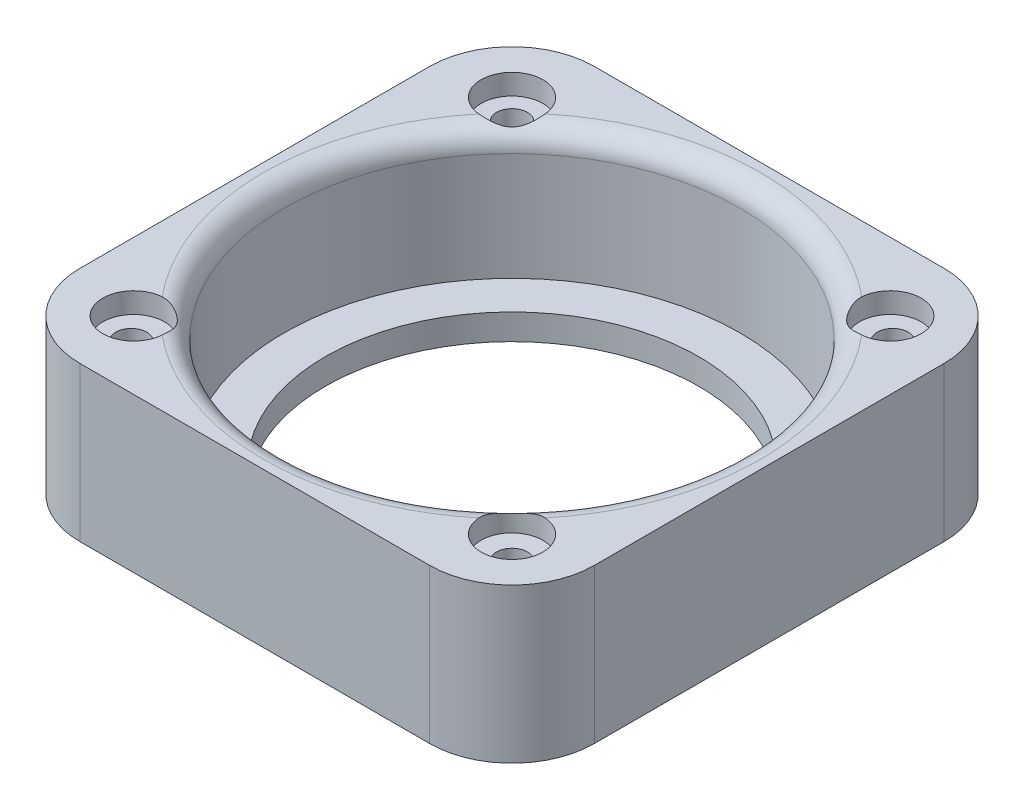
ISO-10303-21;
HEADER;
FILE_DESCRIPTION(('STEP AP214'),'2;1');
FILE_NAME('part.step','',(''),(''),'','','');
FILE_SCHEMA(('AUTOMOTIVE_DESIGN { 1 0 10303 214 1 1 1 1 }'));
ENDSEC;
DATA;
#1=APPLICATION_CONTEXT('core data for automotive mechanical design processes');
#2=APPLICATION_PROTOCOL_DEFINITION('international standard','automotive_design',2000,#1);
#3=PRODUCT_CONTEXT('',#1,'mechanical');
#4=PRODUCT('Part','Part','',(#3));
#5=PRODUCT_RELATED_PRODUCT_CATEGORY('part','',(#4));
#6=PRODUCT_DEFINITION_FORMATION('','',#4);
#7=PRODUCT_DEFINITION_CONTEXT('part definition',#1,'design');
#8=PRODUCT_DEFINITION('design','',#6,#7);
#9=PRODUCT_DEFINITION_SHAPE('','',#8);
#10=(LENGTH_UNIT() NAMED_UNIT(*) SI_UNIT(.MILLI.,.METRE.));
#11=(NAMED_UNIT(*) PLANE_ANGLE_UNIT() SI_UNIT($,.RADIAN.));
#12=(NAMED_UNIT(*) SI_UNIT($,.STERADIAN.) SOLID_ANGLE_UNIT());
#13=UNCERTAINTY_MEASURE_WITH_UNIT(LENGTH_MEASURE(1.E-05),#10,'distance_accuracy_value','');
#14=(GEOMETRIC_REPRESENTATION_CONTEXT(3) GLOBAL_UNCERTAINTY_ASSIGNED_CONTEXT((#13)) GLOBAL_UNIT_ASSIGNED_CONTEXT((#10,
#11,#12)) REPRESENTATION_CONTEXT('',''));
#15=CARTESIAN_POINT('',(0.,0.,0.));
#16=DIRECTION('',(0.,0.,1.));
#17=DIRECTION('',(1.,0.,0.));
#18=AXIS2_PLACEMENT_3D('',#15,#16,#17);
#19=CARTESIAN_POINT('',(18.6152236891498,15.,-18.3847763108513));
#20=DIRECTION('',(0.,-1.,0.));
#21=DIRECTION('',(0.,0.,-1.));
#22=AXIS2_PLACEMENT_3D('',#19,#20,#21);
#23=CYLINDRICAL_SURFACE('',#22,1.5);
#24=CARTESIAN_POINT('',(18.6152236891498,0.,-18.3847763108513));
#25=DIRECTION('',(0.,1.,0.));
#26=DIRECTION('',(0.,0.,1.));
#27=AXIS2_PLACEMENT_3D('',#24,#25,#26);
#28=CIRCLE('',#27,1.5);
#29=CARTESIAN_POINT('',(18.6152236891498,0.,-16.8847763108513));
#30=VERTEX_POINT('',#29);
#31=EDGE_CURVE('E261',#30,#30,#28,.T.);
#32=ORIENTED_EDGE('',*,*,#31,.F.);
#33=EDGE_LOOP('',(#32));
#34=FACE_BOUND('',#33,.T.);
#35=CARTESIAN_POINT('',(18.6152236891498,13.,-18.3847763108513));
#36=DIRECTION('',(0.,1.,0.));
#37=DIRECTION('',(0.,0.,1.));
#38=AXIS2_PLACEMENT_3D('',#35,#36,#37);
#39=CIRCLE('',#38,1.5);
#40=CARTESIAN_POINT('',(18.6152236891498,13.,-16.8847763108513));
#41=VERTEX_POINT('',#40);
#42=EDGE_CURVE('E326',#41,#41,#39,.T.);
#43=ORIENTED_EDGE('',*,*,#42,.T.);
#44=EDGE_LOOP('',(#43));
#45=FACE_BOUND('',#44,.T.);
#46=ADVANCED_FACE('F127',(#34,#45),#23,.F.);
#47=CARTESIAN_POINT('',(18.6152236891508,15.,18.6152236891487));
#48=DIRECTION('',(0.,-1.,0.));
#49=DIRECTION('',(0.,0.,-1.));
#50=AXIS2_PLACEMENT_3D('',#47,#48,#49);
#51=CYLINDRICAL_SURFACE('',#50,1.5);
#52=CARTESIAN_POINT('',(18.6152236891508,0.,18.6152236891487));
#53=DIRECTION('',(0.,1.,0.));
#54=DIRECTION('',(0.,0.,1.));
#55=AXIS2_PLACEMENT_3D('',#52,#53,#54);
#56=CIRCLE('',#55,1.5);
#57=CARTESIAN_POINT('',(18.6152236891508,0.,20.1152236891487));
#58=VERTEX_POINT('',#57);
#59=EDGE_CURVE('E246',#58,#58,#56,.T.);
#60=ORIENTED_EDGE('',*,*,#59,.F.);
#61=EDGE_LOOP('',(#60));
#62=FACE_BOUND('',#61,.T.);
#63=CARTESIAN_POINT('',(18.6152236891508,13.,18.6152236891487));
#64=DIRECTION('',(0.,1.,0.));
#65=DIRECTION('',(0.,0.,1.));
#66=AXIS2_PLACEMENT_3D('',#63,#64,#65);
#67=CIRCLE('',#66,1.5);
#68=CARTESIAN_POINT('',(18.6152236891508,13.,20.1152236891487));
#69=VERTEX_POINT('',#68);
#70=EDGE_CURVE('E323',#69,#69,#67,.T.);
#71=ORIENTED_EDGE('',*,*,#70,.T.);
#72=EDGE_LOOP('',(#71));
#73=FACE_BOUND('',#72,.T.);
#74=ADVANCED_FACE('F418',(#62,#73),#51,.F.);
#75=CARTESIAN_POINT('',(-18.3847763108492,15.,18.6152236891498));
#76=DIRECTION('',(0.,-1.,0.));
#77=DIRECTION('',(0.,0.,-1.));
#78=AXIS2_PLACEMENT_3D('',#75,#76,#77);
#79=CYLINDRICAL_SURFACE('',#78,1.5);
#80=CARTESIAN_POINT('',(-18.3847763108492,0.,18.6152236891498));
#81=DIRECTION('',(0.,1.,0.));
#82=DIRECTION('',(0.,0.,1.));
#83=AXIS2_PLACEMENT_3D('',#80,#81,#82);
#84=CIRCLE('',#83,1.5);
#85=CARTESIAN_POINT('',(-18.3847763108492,0.,20.1152236891498));
#86=VERTEX_POINT('',#85);
#87=EDGE_CURVE('E248',#86,#86,#84,.T.);
#88=ORIENTED_EDGE('',*,*,#87,.F.);
#89=EDGE_LOOP('',(#88));
#90=FACE_BOUND('',#89,.T.);
#91=CARTESIAN_POINT('',(-18.3847763108492,13.,18.6152236891498));
#92=DIRECTION('',(0.,1.,0.));
#93=DIRECTION('',(0.,0.,1.));
#94=AXIS2_PLACEMENT_3D('',#91,#92,#93);
#95=CIRCLE('',#94,1.5);
#96=CARTESIAN_POINT('',(-18.3847763108492,13.,20.1152236891498));
#97=VERTEX_POINT('',#96);
#98=EDGE_CURVE('E318',#97,#97,#95,.T.);
#99=ORIENTED_EDGE('',*,*,#98,.T.);
#100=EDGE_LOOP('',(#99));
#101=FACE_BOUND('',#100,.T.);
#102=ADVANCED_FACE('F424',(#90,#101),#79,.F.);
#103=CARTESIAN_POINT('',(-18.3847763108502,15.,-18.3847763108502));
#104=DIRECTION('',(0.,-1.,0.));
#105=DIRECTION('',(0.,0.,-1.));
#106=AXIS2_PLACEMENT_3D('',#103,#104,#105);
#107=CYLINDRICAL_SURFACE('',#106,1.5);
#108=CARTESIAN_POINT('',(-18.3847763108502,0.,-18.3847763108502));
#109=DIRECTION('',(0.,1.,0.));
#110=DIRECTION('',(0.,0.,1.));
#111=AXIS2_PLACEMENT_3D('',#108,#109,#110);
#112=CIRCLE('',#111,1.5);
#113=CARTESIAN_POINT('',(-18.3847763108502,0.,-16.8847763108502));
#114=VERTEX_POINT('',#113);
#115=EDGE_CURVE('E260',#114,#114,#112,.T.);
#116=ORIENTED_EDGE('',*,*,#115,.F.);
#117=EDGE_LOOP('',(#116));
#118=FACE_BOUND('',#117,.T.);
#119=CARTESIAN_POINT('',(-18.3847763108502,13.,-18.3847763108502));
#120=DIRECTION('',(0.,1.,0.));
#121=DIRECTION('',(0.,0.,1.));
#122=AXIS2_PLACEMENT_3D('',#119,#120,#121);
#123=CIRCLE('',#122,1.5);
#124=CARTESIAN_POINT('',(-18.3847763108502,13.,-16.8847763108502));
#125=VERTEX_POINT('',#124);
#126=EDGE_CURVE('E251',#125,#125,#123,.T.);
#127=ORIENTED_EDGE('',*,*,#126,.T.);
#128=EDGE_LOOP('',(#127));
#129=FACE_BOUND('',#128,.T.);
#130=ADVANCED_FACE('F444',(#118,#129),#107,.F.);
#131=CARTESIAN_POINT('',(0.,15.,0.));
#132=DIRECTION('',(0.,1.,0.));
#133=DIRECTION('',(0.,0.,1.));
#134=AXIS2_PLACEMENT_3D('',#131,#132,#133);
#135=PLANE('',#134);
#136=CARTESIAN_POINT('',(-18.3847763108502,15.,-18.3847763108502));
#137=DIRECTION('',(0.,1.,0.));
#138=DIRECTION('',(0.,0.,1.));
#139=AXIS2_PLACEMENT_3D('',#136,#137,#138);
#140=CIRCLE('',#139,3.);
#141=CARTESIAN_POINT('',(-15.3931257833307,15.,-18.6084437452077));
#142=VERTEX_POINT('',#141);
#143=CARTESIAN_POINT('',(-18.6084437452077,15.,-15.3931257833307));
#144=VERTEX_POINT('',#143);
#145=EDGE_CURVE('E321',#142,#144,#140,.T.);
#146=ORIENTED_EDGE('',*,*,#145,.F.);
#147=CARTESIAN_POINT('',(0.,15.,0.));
#148=DIRECTION('',(0.,1.,0.));
#149=DIRECTION('',(0.,0.,1.));
#150=AXIS2_PLACEMENT_3D('',#147,#148,#149);
#151=CIRCLE('',#150,24.15);
#152=CARTESIAN_POINT('',(15.3931257833305,15.,-18.6084437452079));
#153=VERTEX_POINT('',#152);
#154=EDGE_CURVE('E338',#142,#153,#151,.F.);
#155=ORIENTED_EDGE('',*,*,#154,.T.);
#156=CARTESIAN_POINT('',(18.38477631085,15.,-18.3847763108504));
#157=DIRECTION('',(0.,1.,0.));
#158=DIRECTION('',(-1.,0.,0.));
#159=AXIS2_PLACEMENT_3D('',#156,#157,#158);
#160=CIRCLE('',#159,3.);
#161=CARTESIAN_POINT('',(18.6084437452075,15.,-15.3931257833309));
#162=VERTEX_POINT('',#161);
#163=EDGE_CURVE('E393',#162,#153,#160,.T.);
#164=ORIENTED_EDGE('',*,*,#163,.F.);
#165=CARTESIAN_POINT('',(0.,15.,0.));
#166=DIRECTION('',(0.,1.,0.));
#167=DIRECTION('',(0.,0.,1.));
#168=AXIS2_PLACEMENT_3D('',#165,#166,#167);
#169=CIRCLE('',#168,24.15);
#170=CARTESIAN_POINT('',(18.6084437452077,15.,15.3931257833307));
#171=VERTEX_POINT('',#170);
#172=EDGE_CURVE('E336',#162,#171,#169,.F.);
#173=ORIENTED_EDGE('',*,*,#172,.T.);
#174=CARTESIAN_POINT('',(18.3847763108502,15.,18.3847763108502));
#175=DIRECTION('',(0.,1.,0.));
#176=DIRECTION('',(0.,0.,-1.));
#177=AXIS2_PLACEMENT_3D('',#174,#175,#176);
#178=CIRCLE('',#177,3.);
#179=CARTESIAN_POINT('',(15.3931257833307,15.,18.6084437452077));
#180=VERTEX_POINT('',#179);
#181=EDGE_CURVE('E381',#180,#171,#178,.T.);
#182=ORIENTED_EDGE('',*,*,#181,.F.);
#183=CARTESIAN_POINT('',(0.,15.,0.));
#184=DIRECTION('',(0.,1.,0.));
#185=DIRECTION('',(0.,0.,1.));
#186=AXIS2_PLACEMENT_3D('',#183,#184,#185);
#187=CIRCLE('',#186,24.15);
#188=CARTESIAN_POINT('',(-15.3931257833306,15.,18.6084437452078));
#189=VERTEX_POINT('',#188);
#190=EDGE_CURVE('E334',#180,#189,#187,.F.);
#191=ORIENTED_EDGE('',*,*,#190,.T.);
#192=CARTESIAN_POINT('',(-18.3847763108502,15.,18.3847763108503));
#193=DIRECTION('',(0.,1.,0.));
#194=DIRECTION('',(1.,0.,0.));
#195=AXIS2_PLACEMENT_3D('',#192,#193,#194);
#196=CIRCLE('',#195,3.);
#197=CARTESIAN_POINT('',(-18.6084437452077,15.,15.3931257833308));
#198=VERTEX_POINT('',#197);
#199=EDGE_CURVE('E330',#198,#189,#196,.T.);
#200=ORIENTED_EDGE('',*,*,#199,.F.);
#201=CARTESIAN_POINT('',(0.,15.,0.));
#202=DIRECTION('',(0.,1.,0.));
#203=DIRECTION('',(0.,0.,1.));
#204=AXIS2_PLACEMENT_3D('',#201,#202,#203);
#205=CIRCLE('',#204,24.15);
#206=EDGE_CURVE('E147',#198,#144,#205,.F.);
#207=ORIENTED_EDGE('',*,*,#206,.T.);
#208=EDGE_LOOP('',(#146,#155,#164,#173,#182,#191,#200,#207));
#209=FACE_BOUND('',#208,.T.);
#210=DIRECTION('',(0.,0.,1.));
#211=VECTOR('',#210,1.);
#212=CARTESIAN_POINT('',(-25.,15.,0.));
#213=LINE('',#212,#211);
#214=CARTESIAN_POINT('',(-25.,15.,-17.));
#215=VERTEX_POINT('',#214);
#216=CARTESIAN_POINT('',(-25.,15.,17.));
#217=VERTEX_POINT('',#216);
#218=EDGE_CURVE('E269',#215,#217,#213,.T.);
#219=ORIENTED_EDGE('',*,*,#218,.T.);
#220=CARTESIAN_POINT('',(-17.,15.,17.));
#221=DIRECTION('',(0.,1.,0.));
#222=DIRECTION('',(0.,0.,1.));
#223=AXIS2_PLACEMENT_3D('',#220,#221,#222);
#224=CIRCLE('',#223,8.);
#225=CARTESIAN_POINT('',(-17.,15.,25.));
#226=VERTEX_POINT('',#225);
#227=EDGE_CURVE('E302',#217,#226,#224,.T.);
#228=ORIENTED_EDGE('',*,*,#227,.T.);
#229=DIRECTION('',(1.,0.,0.));
#230=VECTOR('',#229,1.);
#231=CARTESIAN_POINT('',(0.,15.,25.));
#232=LINE('',#231,#230);
#233=CARTESIAN_POINT('',(17.,15.,25.));
#234=VERTEX_POINT('',#233);
#235=EDGE_CURVE('E240',#226,#234,#232,.T.);
#236=ORIENTED_EDGE('',*,*,#235,.T.);
#237=CARTESIAN_POINT('',(17.,15.,17.));
#238=DIRECTION('',(0.,1.,0.));
#239=DIRECTION('',(0.,0.,1.));
#240=AXIS2_PLACEMENT_3D('',#237,#238,#239);
#241=CIRCLE('',#240,8.);
#242=CARTESIAN_POINT('',(25.,15.,17.));
#243=VERTEX_POINT('',#242);
#244=EDGE_CURVE('E300',#234,#243,#241,.T.);
#245=ORIENTED_EDGE('',*,*,#244,.T.);
#246=DIRECTION('',(0.,0.,1.));
#247=VECTOR('',#246,1.);
#248=CARTESIAN_POINT('',(25.,15.,0.));
#249=LINE('',#248,#247);
#250=CARTESIAN_POINT('',(25.,15.,-17.));
#251=VERTEX_POINT('',#250);
#252=EDGE_CURVE('E256',#251,#243,#249,.T.);
#253=ORIENTED_EDGE('',*,*,#252,.F.);
#254=CARTESIAN_POINT('',(17.,15.,-17.));
#255=DIRECTION('',(0.,1.,0.));
#256=DIRECTION('',(0.,0.,1.));
#257=AXIS2_PLACEMENT_3D('',#254,#255,#256);
#258=CIRCLE('',#257,8.);
#259=CARTESIAN_POINT('',(17.,15.,-25.));
#260=VERTEX_POINT('',#259);
#261=EDGE_CURVE('E298',#251,#260,#258,.T.);
#262=ORIENTED_EDGE('',*,*,#261,.T.);
#263=DIRECTION('',(1.,0.,0.));
#264=VECTOR('',#263,1.);
#265=CARTESIAN_POINT('',(0.,15.,-25.));
#266=LINE('',#265,#264);
#267=CARTESIAN_POINT('',(-17.,15.,-25.));
#268=VERTEX_POINT('',#267);
#269=EDGE_CURVE('E266',#268,#260,#266,.T.);
#270=ORIENTED_EDGE('',*,*,#269,.F.);
#271=CARTESIAN_POINT('',(-17.,15.,-17.));
#272=DIRECTION('',(0.,1.,0.));
#273=DIRECTION('',(0.,0.,1.));
#274=AXIS2_PLACEMENT_3D('',#271,#272,#273);
#275=CIRCLE('',#274,8.);
#276=EDGE_CURVE('E296',#268,#215,#275,.T.);
#277=ORIENTED_EDGE('',*,*,#276,.T.);
#278=EDGE_LOOP('',(#219,#228,#236,#245,#253,#262,#270,#277));
#279=FACE_BOUND('',#278,.T.);
#280=ADVANCED_FACE('F385',(#209,#279),#135,.T.);
#281=CARTESIAN_POINT('',(0.,0.,0.));
#282=DIRECTION('',(0.,1.,0.));
#283=DIRECTION('',(0.,0.,1.));
#284=AXIS2_PLACEMENT_3D('',#281,#282,#283);
#285=PLANE('',#284);
#286=ORIENTED_EDGE('',*,*,#59,.T.);
#287=EDGE_LOOP('',(#286));
#288=FACE_BOUND('',#287,.T.);
#289=ORIENTED_EDGE('',*,*,#87,.T.);
#290=EDGE_LOOP('',(#289));
#291=FACE_BOUND('',#290,.T.);
#292=ORIENTED_EDGE('',*,*,#31,.T.);
#293=EDGE_LOOP('',(#292));
#294=FACE_BOUND('',#293,.T.);
#295=ORIENTED_EDGE('',*,*,#115,.T.);
#296=EDGE_LOOP('',(#295));
#297=FACE_BOUND('',#296,.T.);
#298=CARTESIAN_POINT('',(0.,0.,0.));
#299=DIRECTION('',(0.,1.,0.));
#300=DIRECTION('',(0.,0.,1.));
#301=AXIS2_PLACEMENT_3D('',#298,#299,#300);
#302=CIRCLE('',#301,18.15);
#303=CARTESIAN_POINT('',(0.,0.,18.15));
#304=VERTEX_POINT('',#303);
#305=EDGE_CURVE('E282',#304,#304,#302,.T.);
#306=ORIENTED_EDGE('',*,*,#305,.T.);
#307=EDGE_LOOP('',(#306));
#308=FACE_BOUND('',#307,.T.);
#309=DIRECTION('',(1.,0.,0.));
#310=VECTOR('',#309,1.);
#311=CARTESIAN_POINT('',(0.,0.,25.));
#312=LINE('',#311,#310);
#313=CARTESIAN_POINT('',(-17.,0.,25.));
#314=VERTEX_POINT('',#313);
#315=CARTESIAN_POINT('',(17.,0.,25.));
#316=VERTEX_POINT('',#315);
#317=EDGE_CURVE('E237',#314,#316,#312,.T.);
#318=ORIENTED_EDGE('',*,*,#317,.F.);
#319=CARTESIAN_POINT('',(-17.,0.,17.));
#320=DIRECTION('',(0.,1.,0.));
#321=DIRECTION('',(0.,0.,1.));
#322=AXIS2_PLACEMENT_3D('',#319,#320,#321);
#323=CIRCLE('',#322,8.);
#324=CARTESIAN_POINT('',(-25.,0.,17.));
#325=VERTEX_POINT('',#324);
#326=EDGE_CURVE('E220',#314,#325,#323,.F.);
#327=ORIENTED_EDGE('',*,*,#326,.T.);
#328=DIRECTION('',(0.,0.,1.));
#329=VECTOR('',#328,1.);
#330=CARTESIAN_POINT('',(-25.,0.,0.));
#331=LINE('',#330,#329);
#332=CARTESIAN_POINT('',(-25.,0.,-17.));
#333=VERTEX_POINT('',#332);
#334=EDGE_CURVE('E270',#333,#325,#331,.T.);
#335=ORIENTED_EDGE('',*,*,#334,.F.);
#336=CARTESIAN_POINT('',(-17.,0.,-17.));
#337=DIRECTION('',(0.,1.,0.));
#338=DIRECTION('',(0.,0.,1.));
#339=AXIS2_PLACEMENT_3D('',#336,#337,#338);
#340=CIRCLE('',#339,8.);
#341=CARTESIAN_POINT('',(-17.,0.,-25.));
#342=VERTEX_POINT('',#341);
#343=EDGE_CURVE('E241',#333,#342,#340,.F.);
#344=ORIENTED_EDGE('',*,*,#343,.T.);
#345=DIRECTION('',(1.,0.,0.));
#346=VECTOR('',#345,1.);
#347=CARTESIAN_POINT('',(0.,0.,-25.));
#348=LINE('',#347,#346);
#349=CARTESIAN_POINT('',(17.,0.,-25.));
#350=VERTEX_POINT('',#349);
#351=EDGE_CURVE('E276',#342,#350,#348,.T.);
#352=ORIENTED_EDGE('',*,*,#351,.T.);
#353=CARTESIAN_POINT('',(17.,0.,-17.));
#354=DIRECTION('',(0.,1.,0.));
#355=DIRECTION('',(0.,0.,1.));
#356=AXIS2_PLACEMENT_3D('',#353,#354,#355);
#357=CIRCLE('',#356,8.);
#358=CARTESIAN_POINT('',(25.,0.,-17.));
#359=VERTEX_POINT('',#358);
#360=EDGE_CURVE('E290',#350,#359,#357,.F.);
#361=ORIENTED_EDGE('',*,*,#360,.T.);
#362=DIRECTION('',(0.,0.,1.));
#363=VECTOR('',#362,1.);
#364=CARTESIAN_POINT('',(25.,0.,0.));
#365=LINE('',#364,#363);
#366=CARTESIAN_POINT('',(25.,0.,17.));
#367=VERTEX_POINT('',#366);
#368=EDGE_CURVE('E258',#359,#367,#365,.T.);
#369=ORIENTED_EDGE('',*,*,#368,.T.);
#370=CARTESIAN_POINT('',(17.,0.,17.));
#371=DIRECTION('',(0.,1.,0.));
#372=DIRECTION('',(0.,0.,1.));
#373=AXIS2_PLACEMENT_3D('',#370,#371,#372);
#374=CIRCLE('',#373,8.);
#375=EDGE_CURVE('E231',#367,#316,#374,.F.);
#376=ORIENTED_EDGE('',*,*,#375,.T.);
#377=EDGE_LOOP('',(#318,#327,#335,#344,#352,#361,#369,#376));
#378=FACE_BOUND('',#377,.T.);
#379=ADVANCED_FACE('F244',(#288,#291,#294,#297,#308,#378),#285,.F.);
#380=CARTESIAN_POINT('',(0.,2.5,0.));
#381=DIRECTION('',(0.,1.,0.));
#382=DIRECTION('',(0.,0.,1.));
#383=AXIS2_PLACEMENT_3D('',#380,#381,#382);
#384=CYLINDRICAL_SURFACE('',#383,22.15);
#385=CARTESIAN_POINT('',(0.,13.,0.));
#386=DIRECTION('',(0.,1.,0.));
#387=DIRECTION('',(0.,0.,1.));
#388=AXIS2_PLACEMENT_3D('',#385,#386,#387);
#389=CIRCLE('',#388,22.15);
#390=CARTESIAN_POINT('',(0.,13.,22.15));
#391=VERTEX_POINT('',#390);
#392=EDGE_CURVE('E314',#391,#391,#389,.T.);
#393=ORIENTED_EDGE('',*,*,#392,.T.);
#394=EDGE_LOOP('',(#393));
#395=FACE_BOUND('',#394,.T.);
#396=CARTESIAN_POINT('',(0.,2.5,0.));
#397=DIRECTION('',(0.,1.,0.));
#398=DIRECTION('',(0.,0.,1.));
#399=AXIS2_PLACEMENT_3D('',#396,#397,#398);
#400=CIRCLE('',#399,22.15);
#401=CARTESIAN_POINT('',(0.,2.5,22.15));
#402=VERTEX_POINT('',#401);
#403=EDGE_CURVE('E285',#402,#402,#400,.T.);
#404=ORIENTED_EDGE('',*,*,#403,.F.);
#405=EDGE_LOOP('',(#404));
#406=FACE_BOUND('',#405,.T.);
#407=ADVANCED_FACE('F454',(#395,#406),#384,.F.);
#408=CARTESIAN_POINT('',(0.,2.5,0.));
#409=DIRECTION('',(0.,1.,0.));
#410=DIRECTION('',(0.,0.,1.));
#411=AXIS2_PLACEMENT_3D('',#408,#409,#410);
#412=PLANE('',#411);
#413=CARTESIAN_POINT('',(0.,2.5,0.));
#414=DIRECTION('',(0.,1.,0.));
#415=DIRECTION('',(0.,0.,1.));
#416=AXIS2_PLACEMENT_3D('',#413,#414,#415);
#417=CIRCLE('',#416,18.15);
#418=CARTESIAN_POINT('',(0.,2.5,18.15));
#419=VERTEX_POINT('',#418);
#420=EDGE_CURVE('E273',#419,#419,#417,.T.);
#421=ORIENTED_EDGE('',*,*,#420,.F.);
#422=EDGE_LOOP('',(#421));
#423=FACE_BOUND('',#422,.T.);
#424=ORIENTED_EDGE('',*,*,#403,.T.);
#425=EDGE_LOOP('',(#424));
#426=FACE_BOUND('',#425,.T.);
#427=ADVANCED_FACE('F450',(#423,#426),#412,.T.);
#428=CARTESIAN_POINT('',(0.,-10.,0.));
#429=DIRECTION('',(0.,1.,0.));
#430=DIRECTION('',(0.,0.,1.));
#431=AXIS2_PLACEMENT_3D('',#428,#429,#430);
#432=CYLINDRICAL_SURFACE('',#431,18.15);
#433=ORIENTED_EDGE('',*,*,#420,.T.);
#434=EDGE_LOOP('',(#433));
#435=FACE_BOUND('',#434,.T.);
#436=ORIENTED_EDGE('',*,*,#305,.F.);
#437=EDGE_LOOP('',(#436));
#438=FACE_BOUND('',#437,.T.);
#439=ADVANCED_FACE('F442',(#435,#438),#432,.F.);
#440=CARTESIAN_POINT('',(0.,15.,-25.));
#441=DIRECTION('',(0.,0.,-1.));
#442=DIRECTION('',(-1.,0.,0.));
#443=AXIS2_PLACEMENT_3D('',#440,#441,#442);
#444=PLANE('',#443);
#445=ORIENTED_EDGE('',*,*,#269,.T.);
#446=DIRECTION('',(0.,-1.,0.));
#447=VECTOR('',#446,1.);
#448=CARTESIAN_POINT('',(17.,15.,-25.));
#449=LINE('',#448,#447);
#450=EDGE_CURVE('E311',#260,#350,#449,.T.);
#451=ORIENTED_EDGE('',*,*,#450,.T.);
#452=ORIENTED_EDGE('',*,*,#351,.F.);
#453=DIRECTION('',(0.,-1.,0.));
#454=VECTOR('',#453,1.);
#455=CARTESIAN_POINT('',(-17.,15.,-25.));
#456=LINE('',#455,#454);
#457=EDGE_CURVE('E309',#342,#268,#456,.F.);
#458=ORIENTED_EDGE('',*,*,#457,.T.);
#459=EDGE_LOOP('',(#445,#451,#452,#458));
#460=FACE_BOUND('',#459,.T.);
#461=ADVANCED_FACE('F438',(#460),#444,.T.);
#462=CARTESIAN_POINT('',(-25.,15.,0.));
#463=DIRECTION('',(1.,0.,0.));
#464=DIRECTION('',(0.,0.,-1.));
#465=AXIS2_PLACEMENT_3D('',#462,#463,#464);
#466=PLANE('',#465);
#467=ORIENTED_EDGE('',*,*,#334,.T.);
#468=DIRECTION('',(0.,-1.,0.));
#469=VECTOR('',#468,1.);
#470=CARTESIAN_POINT('',(-25.,15.,17.));
#471=LINE('',#470,#469);
#472=EDGE_CURVE('E225',#325,#217,#471,.F.);
#473=ORIENTED_EDGE('',*,*,#472,.T.);
#474=ORIENTED_EDGE('',*,*,#218,.F.);
#475=DIRECTION('',(0.,-1.,0.));
#476=VECTOR('',#475,1.);
#477=CARTESIAN_POINT('',(-25.,0.,-17.));
#478=LINE('',#477,#476);
#479=EDGE_CURVE('E230',#215,#333,#478,.T.);
#480=ORIENTED_EDGE('',*,*,#479,.T.);
#481=EDGE_LOOP('',(#467,#473,#474,#480));
#482=FACE_BOUND('',#481,.T.);
#483=ADVANCED_FACE('F434',(#482),#466,.F.);
#484=CARTESIAN_POINT('',(25.,15.,0.));
#485=DIRECTION('',(1.,0.,0.));
#486=DIRECTION('',(0.,0.,-1.));
#487=AXIS2_PLACEMENT_3D('',#484,#485,#486);
#488=PLANE('',#487);
#489=ORIENTED_EDGE('',*,*,#252,.T.);
#490=DIRECTION('',(0.,-1.,0.));
#491=VECTOR('',#490,1.);
#492=CARTESIAN_POINT('',(25.,0.,17.));
#493=LINE('',#492,#491);
#494=EDGE_CURVE('E306',#243,#367,#493,.T.);
#495=ORIENTED_EDGE('',*,*,#494,.T.);
#496=ORIENTED_EDGE('',*,*,#368,.F.);
#497=DIRECTION('',(0.,-1.,0.));
#498=VECTOR('',#497,1.);
#499=CARTESIAN_POINT('',(25.,15.,-17.));
#500=LINE('',#499,#498);
#501=EDGE_CURVE('E304',#359,#251,#500,.F.);
#502=ORIENTED_EDGE('',*,*,#501,.T.);
#503=EDGE_LOOP('',(#489,#495,#496,#502));
#504=FACE_BOUND('',#503,.T.);
#505=ADVANCED_FACE('F431',(#504),#488,.T.);
#506=CARTESIAN_POINT('',(0.,15.,25.));
#507=DIRECTION('',(0.,0.,-1.));
#508=DIRECTION('',(-1.,0.,0.));
#509=AXIS2_PLACEMENT_3D('',#506,#507,#508);
#510=PLANE('',#509);
#511=ORIENTED_EDGE('',*,*,#235,.F.);
#512=DIRECTION('',(0.,-1.,0.));
#513=VECTOR('',#512,1.);
#514=CARTESIAN_POINT('',(-17.,15.,25.));
#515=LINE('',#514,#513);
#516=EDGE_CURVE('E224',#226,#314,#515,.T.);
#517=ORIENTED_EDGE('',*,*,#516,.T.);
#518=ORIENTED_EDGE('',*,*,#317,.T.);
#519=DIRECTION('',(0.,-1.,0.));
#520=VECTOR('',#519,1.);
#521=CARTESIAN_POINT('',(17.,15.,25.));
#522=LINE('',#521,#520);
#523=EDGE_CURVE('E242',#316,#234,#522,.F.);
#524=ORIENTED_EDGE('',*,*,#523,.T.);
#525=EDGE_LOOP('',(#511,#517,#518,#524));
#526=FACE_BOUND('',#525,.T.);
#527=ADVANCED_FACE('F236',(#526),#510,.F.);
#528=CARTESIAN_POINT('',(-17.,15.,17.));
#529=DIRECTION('',(0.,-1.,0.));
#530=DIRECTION('',(0.,0.,-1.));
#531=AXIS2_PLACEMENT_3D('',#528,#529,#530);
#532=CYLINDRICAL_SURFACE('',#531,8.);
#533=ORIENTED_EDGE('',*,*,#227,.F.);
#534=ORIENTED_EDGE('',*,*,#472,.F.);
#535=ORIENTED_EDGE('',*,*,#326,.F.);
#536=ORIENTED_EDGE('',*,*,#516,.F.);
#537=EDGE_LOOP('',(#533,#534,#535,#536));
#538=FACE_BOUND('',#537,.T.);
#539=ADVANCED_FACE('F223',(#538),#532,.T.);
#540=CARTESIAN_POINT('',(17.,15.,17.));
#541=DIRECTION('',(0.,1.,0.));
#542=DIRECTION('',(0.,0.,1.));
#543=AXIS2_PLACEMENT_3D('',#540,#541,#542);
#544=CYLINDRICAL_SURFACE('',#543,8.);
#545=ORIENTED_EDGE('',*,*,#244,.F.);
#546=ORIENTED_EDGE('',*,*,#523,.F.);
#547=ORIENTED_EDGE('',*,*,#375,.F.);
#548=ORIENTED_EDGE('',*,*,#494,.F.);
#549=EDGE_LOOP('',(#545,#546,#547,#548));
#550=FACE_BOUND('',#549,.T.);
#551=ADVANCED_FACE('F466',(#550),#544,.T.);
#552=CARTESIAN_POINT('',(17.,15.,-17.));
#553=DIRECTION('',(0.,-1.,0.));
#554=DIRECTION('',(0.,0.,-1.));
#555=AXIS2_PLACEMENT_3D('',#552,#553,#554);
#556=CYLINDRICAL_SURFACE('',#555,8.);
#557=ORIENTED_EDGE('',*,*,#261,.F.);
#558=ORIENTED_EDGE('',*,*,#501,.F.);
#559=ORIENTED_EDGE('',*,*,#360,.F.);
#560=ORIENTED_EDGE('',*,*,#450,.F.);
#561=EDGE_LOOP('',(#557,#558,#559,#560));
#562=FACE_BOUND('',#561,.T.);
#563=ADVANCED_FACE('F412',(#562),#556,.T.);
#564=CARTESIAN_POINT('',(-17.,15.,-17.));
#565=DIRECTION('',(0.,1.,0.));
#566=DIRECTION('',(0.,0.,1.));
#567=AXIS2_PLACEMENT_3D('',#564,#565,#566);
#568=CYLINDRICAL_SURFACE('',#567,8.);
#569=ORIENTED_EDGE('',*,*,#276,.F.);
#570=ORIENTED_EDGE('',*,*,#457,.F.);
#571=ORIENTED_EDGE('',*,*,#343,.F.);
#572=ORIENTED_EDGE('',*,*,#479,.F.);
#573=EDGE_LOOP('',(#569,#570,#571,#572));
#574=FACE_BOUND('',#573,.T.);
#575=ADVANCED_FACE('F405',(#574),#568,.T.);
#576=CARTESIAN_POINT('',(-18.3847763108502,13.,-18.3847763108502));
#577=DIRECTION('',(0.,1.,0.));
#578=DIRECTION('',(0.,0.,1.));
#579=AXIS2_PLACEMENT_3D('',#576,#577,#578);
#580=CYLINDRICAL_SURFACE('',#579,3.);
#581=CARTESIAN_POINT('',(-18.3847763108502,13.,-18.3847763108502));
#582=DIRECTION('',(0.,1.,0.));
#583=DIRECTION('',(0.,0.,1.));
#584=AXIS2_PLACEMENT_3D('',#581,#582,#583);
#585=CIRCLE('',#584,3.);
#586=CARTESIAN_POINT('',(-18.3847763108502,13.,-15.3847763108502));
#587=VERTEX_POINT('',#586);
#588=EDGE_CURVE('E317',#587,#587,#585,.T.);
#589=ORIENTED_EDGE('',*,*,#588,.F.);
#590=EDGE_LOOP('',(#589));
#591=FACE_BOUND('',#590,.T.);
#592=ORIENTED_EDGE('',*,*,#145,.T.);
#593=CARTESIAN_POINT('',(-18.6084437452077,15.,-15.3931257833307));
#594=CARTESIAN_POINT('',(-18.5224009572535,15.00000409305,-15.386669885429));
#595=CARTESIAN_POINT('',(-18.4362074304212,14.9962848474804,-15.3839799280825));
#596=CARTESIAN_POINT('',(-18.2645669905252,14.9829519833669,-15.3859668891825));
#597=CARTESIAN_POINT('',(-18.1791187274282,14.9733535483637,-15.3906248795474));
#598=CARTESIAN_POINT('',(-18.0100836951784,14.9498707697548,-15.4070608893607));
#599=CARTESIAN_POINT('',(-17.9264887436415,14.9360129639429,-15.4187952436611));
#600=CARTESIAN_POINT('',(-17.7610593822728,14.9054583191292,-15.4491248691936));
#601=CARTESIAN_POINT('',(-17.6792259797052,14.8887599020081,-15.4677239609279));
#602=CARTESIAN_POINT('',(-17.4617678212142,14.8419135371,-15.5267817798299));
#603=CARTESIAN_POINT('',(-17.3280838894208,14.8104511088752,-15.5734624144399));
#604=CARTESIAN_POINT('',(-17.0678809819628,14.7505119272045,-15.6855474790559));
#605=CARTESIAN_POINT('',(-16.9413668267229,14.7220371717481,-15.7509643311279));
#606=CARTESIAN_POINT('',(-16.7613126350887,14.6874261552075,-15.8610840254284));
#607=CARTESIAN_POINT('',(-16.7041692379629,14.6773901222594,-15.8987616206544));
#608=CARTESIAN_POINT('',(-16.5923147656055,14.660294524181,-15.978164469468));
#609=CARTESIAN_POINT('',(-16.537602603675,14.6532336170288,-16.0198878875923));
#610=CARTESIAN_POINT('',(-16.4310762205392,14.642627360047,-16.1071052682875));
#611=CARTESIAN_POINT('',(-16.3792567657139,14.6390754533104,-16.1525920255903));
#612=CARTESIAN_POINT('',(-16.2788130305821,14.6357463418988,-16.247096870956));
#613=CARTESIAN_POINT('',(-16.2301886979338,14.6359690753729,-16.2961149011426));
#614=CARTESIAN_POINT('',(-16.1365338388025,14.6401724254148,-16.3972768742814));
#615=CARTESIAN_POINT('',(-16.0915016513778,14.6441512941634,-16.4494193527854));
#616=CARTESIAN_POINT('',(-16.0053032996613,14.6555403404517,-16.5564343958682));
#617=CARTESIAN_POINT('',(-15.9641373621331,14.6629507191056,-16.6113071202932));
#618=CARTESIAN_POINT('',(-15.8465422743394,14.6895863829176,-16.7797438479514));
#619=CARTESIAN_POINT('',(-15.7762042032974,14.7132040913903,-16.8969219398078));
#620=CARTESIAN_POINT('',(-15.6490147003151,14.7677435962191,-17.1453312273706));
#621=CARTESIAN_POINT('',(-15.5931490478086,14.79900251716,-17.2769823330319));
#622=CARTESIAN_POINT('',(-15.5006887310099,14.8606122300196,-17.5467385389005));
#623=CARTESIAN_POINT('',(-15.4640474654846,14.8909650481942,-17.6848271401976));
#624=CARTESIAN_POINT('',(-15.4132385757817,14.9411858873084,-17.9527369315267));
#625=CARTESIAN_POINT('',(-15.3972315605748,14.9617866004862,-18.082055701695));
#626=CARTESIAN_POINT('',(-15.3859514174167,14.9838428307223,-18.2781250143877));
#627=CARTESIAN_POINT('',(-15.3843282799988,14.9897251842116,-18.3440407602016));
#628=CARTESIAN_POINT('',(-15.3854380485391,14.9978070284785,-18.4761524973705));
#629=CARTESIAN_POINT('',(-15.3881774202564,15.0000010427865,-18.5423487594042));
#630=CARTESIAN_POINT('',(-15.3931257833307,15.,-18.6084437452077));
#631=B_SPLINE_CURVE_WITH_KNOTS('',3,(#593,#594,#595,#596,#597,#598,#599,#600,#601,#602,#603,
#604,#605,#606,#607,#608,#609,#610,#611,#612,#613,#614,#615,#616,#617,#618,#619,#620,#621,#622,
#623,#624,#625,#626,#627,#628,#629,#630),.UNSPECIFIED.,.F.,.F.,(4,2,2,2,2,2,2,2,2,2,2,2,2,2,2,2,
2,2,4),(0.,0.25850456885587,0.516344324725682,0.772609115198621,1.02901674291872,
1.46276082185814,1.89679314038401,2.10414282627614,2.3113988803279,2.51826691968505,
2.72513156931886,2.93190000732662,3.13868056517342,3.55306627766171,3.99085023590951,
4.42756801470918,4.82180456059983,5.02017544738749,5.21884061722763),.UNSPECIFIED.);
#632=EDGE_CURVE('E12',#144,#142,#631,.T.);
#633=ORIENTED_EDGE('',*,*,#632,.T.);
#634=EDGE_LOOP('',(#592,#633));
#635=FACE_BOUND('',#634,.T.);
#636=ADVANCED_FACE('F403',(#591,#635),#580,.F.);
#637=CARTESIAN_POINT('',(-18.3847763108502,13.,-18.3847763108502));
#638=DIRECTION('',(0.,1.,0.));
#639=DIRECTION('',(0.,0.,1.));
#640=AXIS2_PLACEMENT_3D('',#637,#638,#639);
#641=PLANE('',#640);
#642=ORIENTED_EDGE('',*,*,#126,.F.);
#643=EDGE_LOOP('',(#642));
#644=FACE_BOUND('',#643,.T.);
#645=ORIENTED_EDGE('',*,*,#588,.T.);
#646=EDGE_LOOP('',(#645));
#647=FACE_BOUND('',#646,.T.);
#648=ADVANCED_FACE('F369',(#644,#647),#641,.T.);
#649=CARTESIAN_POINT('',(-18.3847763108502,13.,18.3847763108503));
#650=DIRECTION('',(0.,1.,0.));
#651=DIRECTION('',(0.,0.,1.));
#652=AXIS2_PLACEMENT_3D('',#649,#650,#651);
#653=CYLINDRICAL_SURFACE('',#652,3.);
#654=CARTESIAN_POINT('',(-18.3847763108502,13.,18.3847763108503));
#655=DIRECTION('',(0.,1.,0.));
#656=DIRECTION('',(1.,0.,0.));
#657=AXIS2_PLACEMENT_3D('',#654,#655,#656);
#658=CIRCLE('',#657,3.);
#659=CARTESIAN_POINT('',(-15.3847763108502,13.,18.3847763108503));
#660=VERTEX_POINT('',#659);
#661=EDGE_CURVE('E322',#660,#660,#658,.T.);
#662=ORIENTED_EDGE('',*,*,#661,.F.);
#663=EDGE_LOOP('',(#662));
#664=FACE_BOUND('',#663,.T.);
#665=ORIENTED_EDGE('',*,*,#199,.T.);
#666=CARTESIAN_POINT('',(-15.3931257833306,15.,18.6084437452078));
#667=CARTESIAN_POINT('',(-15.386669885429,15.00000409305,18.5224009572536));
#668=CARTESIAN_POINT('',(-15.3839799280824,14.9962848474804,18.4362074304213));
#669=CARTESIAN_POINT('',(-15.3859668891824,14.9829519833669,18.2645669905253));
#670=CARTESIAN_POINT('',(-15.3906248795473,14.9733535483637,18.1791187274282));
#671=CARTESIAN_POINT('',(-15.4070608893606,14.9498707697548,18.0100836951785));
#672=CARTESIAN_POINT('',(-15.4187952436611,14.9360129639429,17.9264887436416));
#673=CARTESIAN_POINT('',(-15.4491248691935,14.9054583191292,17.7610593822729));
#674=CARTESIAN_POINT('',(-15.4677239609279,14.8887599020081,17.6792259797052));
#675=CARTESIAN_POINT('',(-15.5267817798298,14.8419135371,17.4617678212143));
#676=CARTESIAN_POINT('',(-15.5734624144398,14.8104511088752,17.3280838894208));
#677=CARTESIAN_POINT('',(-15.6855474790559,14.7505119272045,17.0678809819629));
#678=CARTESIAN_POINT('',(-15.7509643311278,14.7220371717481,16.941366826723));
#679=CARTESIAN_POINT('',(-15.8610840254283,14.6874261552076,16.7613126350888));
#680=CARTESIAN_POINT('',(-15.8987616206543,14.6773901222594,16.7041692379629));
#681=CARTESIAN_POINT('',(-15.9781644694679,14.660294524181,16.5923147656056));
#682=CARTESIAN_POINT('',(-16.0198878875922,14.6532336170288,16.5376026036751));
#683=CARTESIAN_POINT('',(-16.1071052682875,14.642627360047,16.4310762205393));
#684=CARTESIAN_POINT('',(-16.1525920255903,14.6390754533104,16.3792567657139));
#685=CARTESIAN_POINT('',(-16.2470968709559,14.6357463418988,16.2788130305822));
#686=CARTESIAN_POINT('',(-16.2961149011425,14.6359690753729,16.2301886979339));
#687=CARTESIAN_POINT('',(-16.3972768742814,14.6401724254148,16.1365338388025));
#688=CARTESIAN_POINT('',(-16.4494193527853,14.6441512941634,16.0915016513779));
#689=CARTESIAN_POINT('',(-16.5564343958681,14.6555403404517,16.0053032996614));
#690=CARTESIAN_POINT('',(-16.6113071202932,14.6629507191056,15.9641373621332));
#691=CARTESIAN_POINT('',(-16.7797438479513,14.6895863829176,15.8465422743394));
#692=CARTESIAN_POINT('',(-16.8969219398078,14.7132040913903,15.7762042032974));
#693=CARTESIAN_POINT('',(-17.1453312273706,14.7677435962191,15.6490147003151));
#694=CARTESIAN_POINT('',(-17.2769823330318,14.79900251716,15.5931490478086));
#695=CARTESIAN_POINT('',(-17.5467385389004,14.8606122300195,15.50068873101));
#696=CARTESIAN_POINT('',(-17.6848271401976,14.8909650481942,15.4640474654847));
#697=CARTESIAN_POINT('',(-17.9527369315266,14.9411858873084,15.4132385757818));
#698=CARTESIAN_POINT('',(-18.082055701695,14.9617866004862,15.3972315605749));
#699=CARTESIAN_POINT('',(-18.2781250143876,14.9838428307223,15.3859514174167));
#700=CARTESIAN_POINT('',(-18.3440407602015,14.9897251842116,15.3843282799988));
#701=CARTESIAN_POINT('',(-18.4761524973705,14.9978070284785,15.3854380485392));
#702=CARTESIAN_POINT('',(-18.5423487594042,15.0000010427865,15.3881774202565));
#703=CARTESIAN_POINT('',(-18.6084437452076,15.,15.3931257833308));
#704=B_SPLINE_CURVE_WITH_KNOTS('',3,(#666,#667,#668,#669,#670,#671,#672,#673,#674,#675,#676,
#677,#678,#679,#680,#681,#682,#683,#684,#685,#686,#687,#688,#689,#690,#691,#692,#693,#694,#695,
#696,#697,#698,#699,#700,#701,#702,#703),.UNSPECIFIED.,.F.,.F.,(4,2,2,2,2,2,2,2,2,2,2,2,2,2,2,2,
2,2,4),(0.,0.258504568855873,0.516344324725686,0.772609115198617,1.02901674291872,
1.46276082185814,1.89679314038401,2.10414282627614,2.3113988803279,2.51826691968505,
2.72513156931886,2.93190000732662,3.13868056517342,3.55306627766171,3.99085023590951,
4.42756801470917,4.82180456059983,5.02017544738749,5.21884061722764),.UNSPECIFIED.);
#705=EDGE_CURVE('E140',#189,#198,#704,.T.);
#706=ORIENTED_EDGE('',*,*,#705,.T.);
#707=EDGE_LOOP('',(#665,#706));
#708=FACE_BOUND('',#707,.T.);
#709=ADVANCED_FACE('F364',(#664,#708),#653,.F.);
#710=CARTESIAN_POINT('',(-18.3847763108502,13.,18.3847763108503));
#711=DIRECTION('',(0.,1.,0.));
#712=DIRECTION('',(1.,0.,0.));
#713=AXIS2_PLACEMENT_3D('',#710,#711,#712);
#714=PLANE('',#713);
#715=ORIENTED_EDGE('',*,*,#98,.F.);
#716=EDGE_LOOP('',(#715));
#717=FACE_BOUND('',#716,.T.);
#718=ORIENTED_EDGE('',*,*,#661,.T.);
#719=EDGE_LOOP('',(#718));
#720=FACE_BOUND('',#719,.T.);
#721=ADVANCED_FACE('F360',(#717,#720),#714,.T.);
#722=CARTESIAN_POINT('',(18.3847763108502,13.,18.3847763108502));
#723=DIRECTION('',(0.,1.,0.));
#724=DIRECTION('',(0.,0.,1.));
#725=AXIS2_PLACEMENT_3D('',#722,#723,#724);
#726=CYLINDRICAL_SURFACE('',#725,3.);
#727=CARTESIAN_POINT('',(18.3847763108502,13.,18.3847763108502));
#728=DIRECTION('',(0.,1.,0.));
#729=DIRECTION('',(0.,0.,-1.));
#730=AXIS2_PLACEMENT_3D('',#727,#728,#729);
#731=CIRCLE('',#730,3.);
#732=CARTESIAN_POINT('',(18.3847763108502,13.,15.3847763108502));
#733=VERTEX_POINT('',#732);
#734=EDGE_CURVE('E327',#733,#733,#731,.T.);
#735=ORIENTED_EDGE('',*,*,#734,.F.);
#736=EDGE_LOOP('',(#735));
#737=FACE_BOUND('',#736,.T.);
#738=ORIENTED_EDGE('',*,*,#181,.T.);
#739=CARTESIAN_POINT('',(18.6084437452077,15.,15.3931257833307));
#740=CARTESIAN_POINT('',(18.5224009572535,15.00000409305,15.386669885429));
#741=CARTESIAN_POINT('',(18.4362074304212,14.9962848474804,15.3839799280825));
#742=CARTESIAN_POINT('',(18.2645669905252,14.9829519833669,15.3859668891825));
#743=CARTESIAN_POINT('',(18.1791187274282,14.9733535483637,15.3906248795474));
#744=CARTESIAN_POINT('',(18.0100836951784,14.9498707697548,15.4070608893607));
#745=CARTESIAN_POINT('',(17.9264887436415,14.9360129639429,15.4187952436611));
#746=CARTESIAN_POINT('',(17.7610593822728,14.9054583191292,15.4491248691936));
#747=CARTESIAN_POINT('',(17.6792259797052,14.8887599020081,15.4677239609279));
#748=CARTESIAN_POINT('',(17.4617678212142,14.8419135371,15.5267817798299));
#749=CARTESIAN_POINT('',(17.3280838894208,14.8104511088752,15.5734624144399));
#750=CARTESIAN_POINT('',(17.0678809819628,14.7505119272045,15.6855474790559));
#751=CARTESIAN_POINT('',(16.9413668267229,14.7220371717481,15.7509643311279));
#752=CARTESIAN_POINT('',(16.7613126350887,14.6874261552075,15.8610840254284));
#753=CARTESIAN_POINT('',(16.7041692379629,14.6773901222594,15.8987616206544));
#754=CARTESIAN_POINT('',(16.5923147656055,14.660294524181,15.978164469468));
#755=CARTESIAN_POINT('',(16.537602603675,14.6532336170288,16.0198878875923));
#756=CARTESIAN_POINT('',(16.4310762205392,14.642627360047,16.1071052682875));
#757=CARTESIAN_POINT('',(16.3792567657139,14.6390754533104,16.1525920255903));
#758=CARTESIAN_POINT('',(16.2788130305821,14.6357463418988,16.247096870956));
#759=CARTESIAN_POINT('',(16.2301886979338,14.6359690753729,16.2961149011426));
#760=CARTESIAN_POINT('',(16.1365338388025,14.6401724254148,16.3972768742814));
#761=CARTESIAN_POINT('',(16.0915016513778,14.6441512941634,16.4494193527854));
#762=CARTESIAN_POINT('',(16.0053032996613,14.6555403404517,16.5564343958682));
#763=CARTESIAN_POINT('',(15.9641373621331,14.6629507191056,16.6113071202932));
#764=CARTESIAN_POINT('',(15.8465422743394,14.6895863829176,16.7797438479514));
#765=CARTESIAN_POINT('',(15.7762042032974,14.7132040913903,16.8969219398078));
#766=CARTESIAN_POINT('',(15.6490147003151,14.7677435962191,17.1453312273706));
#767=CARTESIAN_POINT('',(15.5931490478086,14.79900251716,17.2769823330319));
#768=CARTESIAN_POINT('',(15.5006887310099,14.8606122300196,17.5467385389005));
#769=CARTESIAN_POINT('',(15.4640474654846,14.8909650481942,17.6848271401976));
#770=CARTESIAN_POINT('',(15.4132385757817,14.9411858873084,17.9527369315267));
#771=CARTESIAN_POINT('',(15.3972315605748,14.9617866004862,18.082055701695));
#772=CARTESIAN_POINT('',(15.3859514174167,14.9838428307223,18.2781250143877));
#773=CARTESIAN_POINT('',(15.3843282799988,14.9897251842116,18.3440407602016));
#774=CARTESIAN_POINT('',(15.3854380485391,14.9978070284785,18.4761524973705));
#775=CARTESIAN_POINT('',(15.3881774202564,15.0000010427865,18.5423487594042));
#776=CARTESIAN_POINT('',(15.3931257833307,15.,18.6084437452077));
#777=B_SPLINE_CURVE_WITH_KNOTS('',3,(#739,#740,#741,#742,#743,#744,#745,#746,#747,#748,#749,
#750,#751,#752,#753,#754,#755,#756,#757,#758,#759,#760,#761,#762,#763,#764,#765,#766,#767,#768,
#769,#770,#771,#772,#773,#774,#775,#776),.UNSPECIFIED.,.F.,.F.,(4,2,2,2,2,2,2,2,2,2,2,2,2,2,2,2,
2,2,4),(0.,0.25850456885587,0.516344324725682,0.772609115198621,1.02901674291872,
1.46276082185814,1.89679314038401,2.10414282627614,2.3113988803279,2.51826691968505,
2.72513156931886,2.93190000732662,3.13868056517342,3.55306627766171,3.99085023590951,
4.42756801470918,4.82180456059983,5.02017544738749,5.21884061722763),.UNSPECIFIED.);
#778=EDGE_CURVE('E347',#171,#180,#777,.T.);
#779=ORIENTED_EDGE('',*,*,#778,.T.);
#780=EDGE_LOOP('',(#738,#779));
#781=FACE_BOUND('',#780,.T.);
#782=ADVANCED_FACE('F363',(#737,#781),#726,.F.);
#783=CARTESIAN_POINT('',(18.3847763108502,13.,18.3847763108502));
#784=DIRECTION('',(0.,1.,0.));
#785=DIRECTION('',(0.,0.,-1.));
#786=AXIS2_PLACEMENT_3D('',#783,#784,#785);
#787=PLANE('',#786);
#788=ORIENTED_EDGE('',*,*,#70,.F.);
#789=EDGE_LOOP('',(#788));
#790=FACE_BOUND('',#789,.T.);
#791=ORIENTED_EDGE('',*,*,#734,.T.);
#792=EDGE_LOOP('',(#791));
#793=FACE_BOUND('',#792,.T.);
#794=ADVANCED_FACE('F358',(#790,#793),#787,.T.);
#795=CARTESIAN_POINT('',(18.38477631085,13.,-18.3847763108504));
#796=DIRECTION('',(0.,1.,0.));
#797=DIRECTION('',(0.,0.,1.));
#798=AXIS2_PLACEMENT_3D('',#795,#796,#797);
#799=CYLINDRICAL_SURFACE('',#798,3.);
#800=CARTESIAN_POINT('',(18.38477631085,13.,-18.3847763108504));
#801=DIRECTION('',(0.,1.,0.));
#802=DIRECTION('',(-1.,0.,0.));
#803=AXIS2_PLACEMENT_3D('',#800,#801,#802);
#804=CIRCLE('',#803,3.);
#805=CARTESIAN_POINT('',(15.38477631085,13.,-18.3847763108504));
#806=VERTEX_POINT('',#805);
#807=EDGE_CURVE('E388',#806,#806,#804,.T.);
#808=ORIENTED_EDGE('',*,*,#807,.F.);
#809=EDGE_LOOP('',(#808));
#810=FACE_BOUND('',#809,.T.);
#811=ORIENTED_EDGE('',*,*,#163,.T.);
#812=CARTESIAN_POINT('',(15.3931257833305,15.,-18.6084437452079));
#813=CARTESIAN_POINT('',(15.3866698854288,15.00000409305,-18.5224009572537));
#814=CARTESIAN_POINT('',(15.3839799280823,14.9962848474804,-18.4362074304214));
#815=CARTESIAN_POINT('',(15.3859668891823,14.9829519833669,-18.2645669905254));
#816=CARTESIAN_POINT('',(15.3906248795472,14.9733535483637,-18.1791187274283));
#817=CARTESIAN_POINT('',(15.4070608893605,14.9498707697548,-18.0100836951786));
#818=CARTESIAN_POINT('',(15.4187952436609,14.9360129639429,-17.9264887436417));
#819=CARTESIAN_POINT('',(15.4491248691934,14.9054583191292,-17.761059382273));
#820=CARTESIAN_POINT('',(15.4677239609278,14.8887599020081,-17.6792259797053));
#821=CARTESIAN_POINT('',(15.5267817798297,14.8419135371,-17.4617678212144));
#822=CARTESIAN_POINT('',(15.5734624144397,14.8104511088752,-17.3280838894209));
#823=CARTESIAN_POINT('',(15.6855474790557,14.7505119272045,-17.067880981963));
#824=CARTESIAN_POINT('',(15.7509643311277,14.7220371717481,-16.9413668267231));
#825=CARTESIAN_POINT('',(15.8610840254282,14.6874261552075,-16.7613126350889));
#826=CARTESIAN_POINT('',(15.8987616206542,14.6773901222594,-16.704169237963));
#827=CARTESIAN_POINT('',(15.9781644694678,14.660294524181,-16.5923147656057));
#828=CARTESIAN_POINT('',(16.0198878875921,14.6532336170288,-16.5376026036752));
#829=CARTESIAN_POINT('',(16.1071052682874,14.642627360047,-16.4310762205394));
#830=CARTESIAN_POINT('',(16.1525920255901,14.6390754533104,-16.379256765714));
#831=CARTESIAN_POINT('',(16.2470968709558,14.6357463418988,-16.2788130305823));
#832=CARTESIAN_POINT('',(16.2961149011424,14.6359690753729,-16.230188697934));
#833=CARTESIAN_POINT('',(16.3972768742813,14.6401724254148,-16.1365338388026));
#834=CARTESIAN_POINT('',(16.4494193527852,14.6441512941634,-16.091501651378));
#835=CARTESIAN_POINT('',(16.556434395868,14.6555403404517,-16.0053032996615));
#836=CARTESIAN_POINT('',(16.6113071202931,14.6629507191056,-15.9641373621333));
#837=CARTESIAN_POINT('',(16.7797438479512,14.6895863829176,-15.8465422743396));
#838=CARTESIAN_POINT('',(16.8969219398077,14.7132040913903,-15.7762042032976));
#839=CARTESIAN_POINT('',(17.1453312273705,14.7677435962191,-15.6490147003152));
#840=CARTESIAN_POINT('',(17.2769823330317,14.79900251716,-15.5931490478088));
#841=CARTESIAN_POINT('',(17.5467385389003,14.8606122300196,-15.5006887310101));
#842=CARTESIAN_POINT('',(17.6848271401975,14.8909650481942,-15.4640474654848));
#843=CARTESIAN_POINT('',(17.9527369315265,14.9411858873084,-15.4132385757819));
#844=CARTESIAN_POINT('',(18.0820557016949,14.9617866004862,-15.397231560575));
#845=CARTESIAN_POINT('',(18.2781250143875,14.9838428307223,-15.3859514174169));
#846=CARTESIAN_POINT('',(18.3440407602014,14.9897251842116,-15.384328279999));
#847=CARTESIAN_POINT('',(18.4761524973704,14.9978070284785,-15.3854380485393));
#848=CARTESIAN_POINT('',(18.5423487594041,15.0000010427865,-15.3881774202566));
#849=CARTESIAN_POINT('',(18.6084437452075,15.,-15.3931257833309));
#850=B_SPLINE_CURVE_WITH_KNOTS('',3,(#812,#813,#814,#815,#816,#817,#818,#819,#820,#821,#822,
#823,#824,#825,#826,#827,#828,#829,#830,#831,#832,#833,#834,#835,#836,#837,#838,#839,#840,#841,
#842,#843,#844,#845,#846,#847,#848,#849),.UNSPECIFIED.,.F.,.F.,(4,2,2,2,2,2,2,2,2,2,2,2,2,2,2,2,
2,2,4),(0.,0.258504568855873,0.516344324725682,0.772609115198618,1.02901674291872,
1.46276082185814,1.89679314038401,2.10414282627614,2.31139888032789,2.51826691968505,
2.72513156931886,2.93190000732663,3.13868056517343,3.55306627766171,3.99085023590952,
4.42756801470918,4.82180456059983,5.0201754473875,5.21884061722764),.UNSPECIFIED.);
#851=EDGE_CURVE('E341',#153,#162,#850,.T.);
#852=ORIENTED_EDGE('',*,*,#851,.T.);
#853=EDGE_LOOP('',(#811,#852));
#854=FACE_BOUND('',#853,.T.);
#855=ADVANCED_FACE('F352',(#810,#854),#799,.F.);
#856=CARTESIAN_POINT('',(18.38477631085,13.,-18.3847763108504));
#857=DIRECTION('',(0.,1.,0.));
#858=DIRECTION('',(-1.,0.,0.));
#859=AXIS2_PLACEMENT_3D('',#856,#857,#858);
#860=PLANE('',#859);
#861=ORIENTED_EDGE('',*,*,#42,.F.);
#862=EDGE_LOOP('',(#861));
#863=FACE_BOUND('',#862,.T.);
#864=ORIENTED_EDGE('',*,*,#807,.T.);
#865=EDGE_LOOP('',(#864));
#866=FACE_BOUND('',#865,.T.);
#867=ADVANCED_FACE('F357',(#863,#866),#860,.T.);
#868=CARTESIAN_POINT('',(0.,13.,0.));
#869=DIRECTION('',(0.,1.,0.));
#870=DIRECTION('',(0.,0.,1.));
#871=AXIS2_PLACEMENT_3D('',#868,#869,#870);
#872=TOROIDAL_SURFACE('',#871,24.15,2.);
#873=ORIENTED_EDGE('',*,*,#851,.F.);
#874=ORIENTED_EDGE('',*,*,#154,.F.);
#875=ORIENTED_EDGE('',*,*,#632,.F.);
#876=ORIENTED_EDGE('',*,*,#206,.F.);
#877=ORIENTED_EDGE('',*,*,#705,.F.);
#878=ORIENTED_EDGE('',*,*,#190,.F.);
#879=ORIENTED_EDGE('',*,*,#778,.F.);
#880=ORIENTED_EDGE('',*,*,#172,.F.);
#881=EDGE_LOOP('',(#873,#874,#875,#876,#877,#878,#879,#880));
#882=FACE_BOUND('',#881,.T.);
#883=ORIENTED_EDGE('',*,*,#392,.F.);
#884=EDGE_LOOP('',(#883));
#885=FACE_BOUND('',#884,.T.);
#886=ADVANCED_FACE('F129',(#882,#885),#872,.T.);
#887=CLOSED_SHELL('',(#46,#74,#102,#130,#280,#379,#407,#427,#439,#461,#483,#505,#527,#539,#551,
#563,#575,#636,#648,#709,#721,#782,#794,#855,#867,#886));
#888=MANIFOLD_SOLID_BREP('B2',#887);
#889=ADVANCED_BREP_SHAPE_REPRESENTATION('',(#18,#888),#14);
#890=SHAPE_DEFINITION_REPRESENTATION(#9,#889);
ENDSEC;
END-ISO-10303-21;
